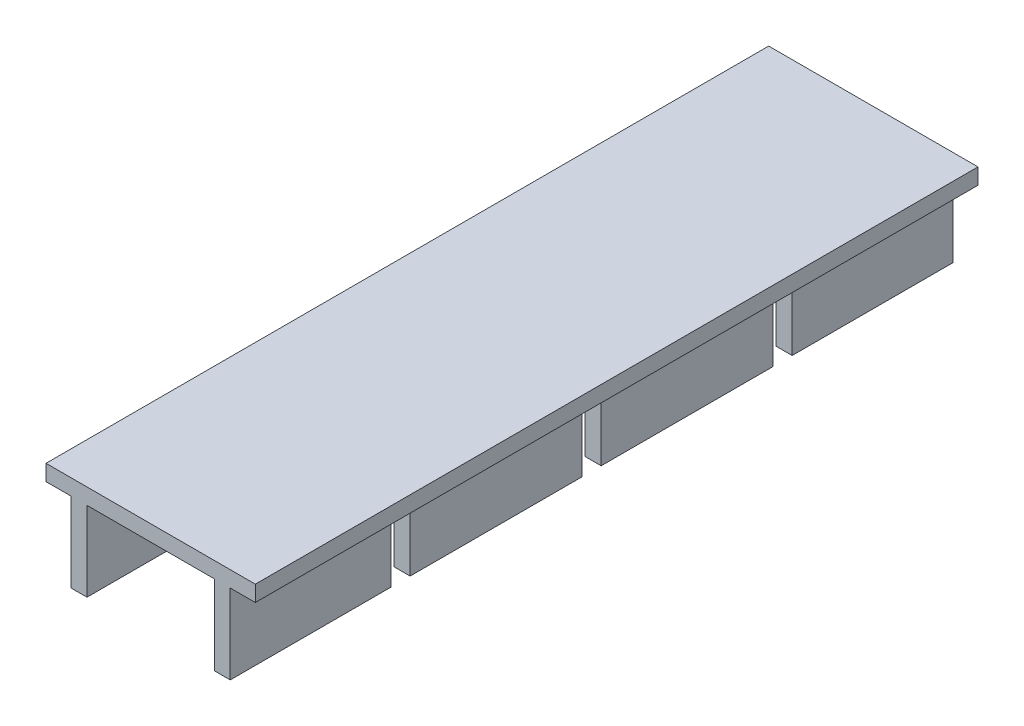
ISO-10303-21;
HEADER;
FILE_DESCRIPTION(('STEP AP214'),'2;1');
FILE_NAME('part.step','',(''),(''),'','','');
FILE_SCHEMA(('AUTOMOTIVE_DESIGN { 1 0 10303 214 1 1 1 1 }'));
ENDSEC;
DATA;
#1=APPLICATION_CONTEXT('core data for automotive mechanical design processes');
#2=APPLICATION_PROTOCOL_DEFINITION('international standard','automotive_design',2000,#1);
#3=PRODUCT_CONTEXT('',#1,'mechanical');
#4=PRODUCT('Part','Part','',(#3));
#5=PRODUCT_RELATED_PRODUCT_CATEGORY('part','',(#4));
#6=PRODUCT_DEFINITION_FORMATION('','',#4);
#7=PRODUCT_DEFINITION_CONTEXT('part definition',#1,'design');
#8=PRODUCT_DEFINITION('design','',#6,#7);
#9=PRODUCT_DEFINITION_SHAPE('','',#8);
#10=(LENGTH_UNIT() NAMED_UNIT(*) SI_UNIT(.MILLI.,.METRE.));
#11=(NAMED_UNIT(*) PLANE_ANGLE_UNIT() SI_UNIT($,.RADIAN.));
#12=(NAMED_UNIT(*) SI_UNIT($,.STERADIAN.) SOLID_ANGLE_UNIT());
#13=UNCERTAINTY_MEASURE_WITH_UNIT(LENGTH_MEASURE(1.E-05),#10,'distance_accuracy_value','');
#14=(GEOMETRIC_REPRESENTATION_CONTEXT(3) GLOBAL_UNCERTAINTY_ASSIGNED_CONTEXT((#13)) GLOBAL_UNIT_ASSIGNED_CONTEXT((#10,
#11,#12)) REPRESENTATION_CONTEXT('',''));
#15=CARTESIAN_POINT('',(0.,0.,0.));
#16=DIRECTION('',(0.,0.,1.));
#17=DIRECTION('',(1.,0.,0.));
#18=AXIS2_PLACEMENT_3D('',#15,#16,#17);
#19=CARTESIAN_POINT('',(0.,0.,288.29));
#20=DIRECTION('',(0.,1.,0.));
#21=DIRECTION('',(0.,0.,1.));
#22=AXIS2_PLACEMENT_3D('',#19,#20,#21);
#23=PLANE('',#22);
#24=DIRECTION('',(0.,0.,-1.));
#25=VECTOR('',#24,1.);
#26=CARTESIAN_POINT('',(0.,0.,288.29));
#27=LINE('',#26,#25);
#28=CARTESIAN_POINT('',(0.,0.,216.535));
#29=VERTEX_POINT('',#28);
#30=CARTESIAN_POINT('',(0.,0.,147.955));
#31=VERTEX_POINT('',#30);
#32=EDGE_CURVE('E51',#29,#31,#27,.T.);
#33=ORIENTED_EDGE('',*,*,#32,.T.);
#34=DIRECTION('',(1.,0.,0.));
#35=VECTOR('',#34,1.);
#36=CARTESIAN_POINT('',(-25.0019910457147,0.,147.955));
#37=LINE('',#36,#35);
#38=CARTESIAN_POINT('',(6.34999999999999,0.,147.955));
#39=VERTEX_POINT('',#38);
#40=EDGE_CURVE('E298',#31,#39,#37,.T.);
#41=ORIENTED_EDGE('',*,*,#40,.T.);
#42=DIRECTION('',(0.,0.,-1.));
#43=VECTOR('',#42,1.);
#44=CARTESIAN_POINT('',(6.35,0.,288.29));
#45=LINE('',#44,#43);
#46=CARTESIAN_POINT('',(6.35,0.,216.535));
#47=VERTEX_POINT('',#46);
#48=EDGE_CURVE('E328',#47,#39,#45,.T.);
#49=ORIENTED_EDGE('',*,*,#48,.F.);
#50=DIRECTION('',(1.,0.,0.));
#51=VECTOR('',#50,1.);
#52=CARTESIAN_POINT('',(-25.0019910457147,0.,216.535));
#53=LINE('',#52,#51);
#54=EDGE_CURVE('E413',#29,#47,#53,.T.);
#55=ORIENTED_EDGE('',*,*,#54,.F.);
#56=EDGE_LOOP('',(#33,#41,#49,#55));
#57=FACE_BOUND('',#56,.T.);
#58=ADVANCED_FACE('F43',(#57),#23,.F.);
#59=CARTESIAN_POINT('',(6.35,0.,140.335));
#60=VERTEX_POINT('',#59);
#61=CARTESIAN_POINT('',(6.34999999999999,0.,71.755));
#62=VERTEX_POINT('',#61);
#63=EDGE_CURVE('E335',#60,#62,#45,.T.);
#64=ORIENTED_EDGE('',*,*,#63,.F.);
#65=DIRECTION('',(1.,0.,0.));
#66=VECTOR('',#65,1.);
#67=CARTESIAN_POINT('',(-25.0019910457147,0.,140.335));
#68=LINE('',#67,#66);
#69=CARTESIAN_POINT('',(0.,0.,140.335));
#70=VERTEX_POINT('',#69);
#71=EDGE_CURVE('E67',#70,#60,#68,.T.);
#72=ORIENTED_EDGE('',*,*,#71,.F.);
#73=CARTESIAN_POINT('',(0.,0.,71.755));
#74=VERTEX_POINT('',#73);
#75=EDGE_CURVE('E333',#70,#74,#27,.T.);
#76=ORIENTED_EDGE('',*,*,#75,.T.);
#77=DIRECTION('',(1.,0.,0.));
#78=VECTOR('',#77,1.);
#79=CARTESIAN_POINT('',(-25.0019910457147,0.,71.755));
#80=LINE('',#79,#78);
#81=EDGE_CURVE('E351',#74,#62,#80,.T.);
#82=ORIENTED_EDGE('',*,*,#81,.T.);
#83=EDGE_LOOP('',(#64,#72,#76,#82));
#84=FACE_BOUND('',#83,.T.);
#85=ADVANCED_FACE('F348',(#84),#23,.F.);
#86=CARTESIAN_POINT('',(57.15,0.,288.29));
#87=DIRECTION('',(0.,1.,0.));
#88=DIRECTION('',(0.,0.,1.));
#89=AXIS2_PLACEMENT_3D('',#86,#87,#88);
#90=PLANE('',#89);
#91=DIRECTION('',(0.,0.,-1.));
#92=VECTOR('',#91,1.);
#93=CARTESIAN_POINT('',(57.15,0.,288.29));
#94=LINE('',#93,#92);
#95=CARTESIAN_POINT('',(57.15,0.,216.535));
#96=VERTEX_POINT('',#95);
#97=CARTESIAN_POINT('',(57.15,0.,147.955));
#98=VERTEX_POINT('',#97);
#99=EDGE_CURVE('E297',#96,#98,#94,.T.);
#100=ORIENTED_EDGE('',*,*,#99,.T.);
#101=CARTESIAN_POINT('',(63.5,0.,147.955));
#102=VERTEX_POINT('',#101);
#103=EDGE_CURVE('E279',#98,#102,#37,.T.);
#104=ORIENTED_EDGE('',*,*,#103,.T.);
#105=DIRECTION('',(0.,0.,-1.));
#106=VECTOR('',#105,1.);
#107=CARTESIAN_POINT('',(63.5,0.,288.29));
#108=LINE('',#107,#106);
#109=CARTESIAN_POINT('',(63.5,0.,216.535));
#110=VERTEX_POINT('',#109);
#111=EDGE_CURVE('E295',#110,#102,#108,.T.);
#112=ORIENTED_EDGE('',*,*,#111,.F.);
#113=EDGE_CURVE('E415',#96,#110,#53,.T.);
#114=ORIENTED_EDGE('',*,*,#113,.F.);
#115=EDGE_LOOP('',(#100,#104,#112,#114));
#116=FACE_BOUND('',#115,.T.);
#117=ADVANCED_FACE('F293',(#116),#90,.F.);
#118=CARTESIAN_POINT('',(63.5,0.,140.335));
#119=VERTEX_POINT('',#118);
#120=CARTESIAN_POINT('',(63.5,0.,71.755));
#121=VERTEX_POINT('',#120);
#122=EDGE_CURVE('E307',#119,#121,#108,.T.);
#123=ORIENTED_EDGE('',*,*,#122,.F.);
#124=CARTESIAN_POINT('',(57.15,0.,140.335));
#125=VERTEX_POINT('',#124);
#126=EDGE_CURVE('E564',#125,#119,#68,.T.);
#127=ORIENTED_EDGE('',*,*,#126,.F.);
#128=CARTESIAN_POINT('',(57.15,0.,71.755));
#129=VERTEX_POINT('',#128);
#130=EDGE_CURVE('E526',#125,#129,#94,.T.);
#131=ORIENTED_EDGE('',*,*,#130,.T.);
#132=EDGE_CURVE('E355',#129,#121,#80,.T.);
#133=ORIENTED_EDGE('',*,*,#132,.T.);
#134=EDGE_LOOP('',(#123,#127,#131,#133));
#135=FACE_BOUND('',#134,.T.);
#136=ADVANCED_FACE('F599',(#135),#90,.F.);
#137=CARTESIAN_POINT('',(0.,0.,288.29));
#138=VERTEX_POINT('',#137);
#139=CARTESIAN_POINT('',(0.,0.,224.155));
#140=VERTEX_POINT('',#139);
#141=EDGE_CURVE('E11',#138,#140,#27,.T.);
#142=ORIENTED_EDGE('',*,*,#141,.T.);
#143=DIRECTION('',(1.,0.,0.));
#144=VECTOR('',#143,1.);
#145=CARTESIAN_POINT('',(-25.0019910457147,0.,224.155));
#146=LINE('',#145,#144);
#147=CARTESIAN_POINT('',(6.34999999999999,0.,224.155));
#148=VERTEX_POINT('',#147);
#149=EDGE_CURVE('E416',#140,#148,#146,.T.);
#150=ORIENTED_EDGE('',*,*,#149,.T.);
#151=CARTESIAN_POINT('',(6.35,0.,288.29));
#152=VERTEX_POINT('',#151);
#153=EDGE_CURVE('E326',#152,#148,#45,.T.);
#154=ORIENTED_EDGE('',*,*,#153,.F.);
#155=DIRECTION('',(1.,0.,0.));
#156=VECTOR('',#155,1.);
#157=CARTESIAN_POINT('',(0.,0.,288.29));
#158=LINE('',#157,#156);
#159=EDGE_CURVE('E439',#138,#152,#158,.T.);
#160=ORIENTED_EDGE('',*,*,#159,.F.);
#161=EDGE_LOOP('',(#142,#150,#154,#160));
#162=FACE_BOUND('',#161,.T.);
#163=ADVANCED_FACE('F542',(#162),#23,.F.);
#164=CARTESIAN_POINT('',(57.15,0.,288.29));
#165=VERTEX_POINT('',#164);
#166=CARTESIAN_POINT('',(57.15,0.,224.155));
#167=VERTEX_POINT('',#166);
#168=EDGE_CURVE('E317',#165,#167,#94,.T.);
#169=ORIENTED_EDGE('',*,*,#168,.T.);
#170=CARTESIAN_POINT('',(63.5,0.,224.155));
#171=VERTEX_POINT('',#170);
#172=EDGE_CURVE('E405',#167,#171,#146,.T.);
#173=ORIENTED_EDGE('',*,*,#172,.T.);
#174=CARTESIAN_POINT('',(63.5,0.,288.29));
#175=VERTEX_POINT('',#174);
#176=EDGE_CURVE('E306',#175,#171,#108,.T.);
#177=ORIENTED_EDGE('',*,*,#176,.F.);
#178=DIRECTION('',(1.,0.,0.));
#179=VECTOR('',#178,1.);
#180=CARTESIAN_POINT('',(57.15,0.,288.29));
#181=LINE('',#180,#179);
#182=EDGE_CURVE('E448',#165,#175,#181,.T.);
#183=ORIENTED_EDGE('',*,*,#182,.F.);
#184=EDGE_LOOP('',(#169,#173,#177,#183));
#185=FACE_BOUND('',#184,.T.);
#186=ADVANCED_FACE('F669',(#185),#90,.F.);
#187=CARTESIAN_POINT('',(0.,0.,288.29));
#188=DIRECTION('',(1.,0.,0.));
#189=DIRECTION('',(0.,0.,-1.));
#190=AXIS2_PLACEMENT_3D('',#187,#188,#189);
#191=PLANE('',#190);
#192=DIRECTION('',(0.,0.,-1.));
#193=VECTOR('',#192,1.);
#194=CARTESIAN_POINT('',(0.,23.8125,147.955));
#195=LINE('',#194,#193);
#196=CARTESIAN_POINT('',(0.,23.8125,147.955));
#197=VERTEX_POINT('',#196);
#198=CARTESIAN_POINT('',(0.,23.8125,140.335));
#199=VERTEX_POINT('',#198);
#200=EDGE_CURVE('E618',#197,#199,#195,.T.);
#201=ORIENTED_EDGE('',*,*,#200,.F.);
#202=DIRECTION('',(0.,1.,0.));
#203=VECTOR('',#202,1.);
#204=CARTESIAN_POINT('',(0.,0.,147.955));
#205=LINE('',#204,#203);
#206=EDGE_CURVE('E366',#31,#197,#205,.T.);
#207=ORIENTED_EDGE('',*,*,#206,.F.);
#208=ORIENTED_EDGE('',*,*,#32,.F.);
#209=DIRECTION('',(0.,-1.,0.));
#210=VECTOR('',#209,1.);
#211=CARTESIAN_POINT('',(0.,0.,216.535));
#212=LINE('',#211,#210);
#213=CARTESIAN_POINT('',(0.,23.8125,216.535));
#214=VERTEX_POINT('',#213);
#215=EDGE_CURVE('E392',#214,#29,#212,.T.);
#216=ORIENTED_EDGE('',*,*,#215,.F.);
#217=DIRECTION('',(0.,0.,-1.));
#218=VECTOR('',#217,1.);
#219=CARTESIAN_POINT('',(0.,23.8125,224.155));
#220=LINE('',#219,#218);
#221=CARTESIAN_POINT('',(0.,23.8125,224.155));
#222=VERTEX_POINT('',#221);
#223=EDGE_CURVE('E394',#222,#214,#220,.T.);
#224=ORIENTED_EDGE('',*,*,#223,.F.);
#225=DIRECTION('',(0.,1.,0.));
#226=VECTOR('',#225,1.);
#227=CARTESIAN_POINT('',(0.,0.,224.155));
#228=LINE('',#227,#226);
#229=EDGE_CURVE('E397',#140,#222,#228,.T.);
#230=ORIENTED_EDGE('',*,*,#229,.F.);
#231=ORIENTED_EDGE('',*,*,#141,.F.);
#232=DIRECTION('',(0.,-1.,0.));
#233=VECTOR('',#232,1.);
#234=CARTESIAN_POINT('',(0.,0.,288.29));
#235=LINE('',#234,#233);
#236=CARTESIAN_POINT('',(0.,31.75,288.29));
#237=VERTEX_POINT('',#236);
#238=EDGE_CURVE('E436',#237,#138,#235,.T.);
#239=ORIENTED_EDGE('',*,*,#238,.F.);
#240=DIRECTION('',(0.,0.,-1.));
#241=VECTOR('',#240,1.);
#242=CARTESIAN_POINT('',(0.,31.75,288.29));
#243=LINE('',#242,#241);
#244=CARTESIAN_POINT('',(0.,31.75,0.));
#245=VERTEX_POINT('',#244);
#246=EDGE_CURVE('E462',#237,#245,#243,.T.);
#247=ORIENTED_EDGE('',*,*,#246,.T.);
#248=DIRECTION('',(0.,-1.,0.));
#249=VECTOR('',#248,1.);
#250=CARTESIAN_POINT('',(0.,0.,0.));
#251=LINE('',#250,#249);
#252=CARTESIAN_POINT('',(0.,0.,0.));
#253=VERTEX_POINT('',#252);
#254=EDGE_CURVE('E435',#245,#253,#251,.T.);
#255=ORIENTED_EDGE('',*,*,#254,.T.);
#256=CARTESIAN_POINT('',(0.,0.,64.135));
#257=VERTEX_POINT('',#256);
#258=EDGE_CURVE('E52',#257,#253,#27,.T.);
#259=ORIENTED_EDGE('',*,*,#258,.F.);
#260=DIRECTION('',(0.,-1.,0.));
#261=VECTOR('',#260,1.);
#262=CARTESIAN_POINT('',(0.,0.,64.135));
#263=LINE('',#262,#261);
#264=CARTESIAN_POINT('',(0.,23.8125,64.135));
#265=VERTEX_POINT('',#264);
#266=EDGE_CURVE('E568',#265,#257,#263,.T.);
#267=ORIENTED_EDGE('',*,*,#266,.F.);
#268=DIRECTION('',(0.,0.,-1.));
#269=VECTOR('',#268,1.);
#270=CARTESIAN_POINT('',(0.,23.8125,71.755));
#271=LINE('',#270,#269);
#272=CARTESIAN_POINT('',(0.,23.8125,71.755));
#273=VERTEX_POINT('',#272);
#274=EDGE_CURVE('E570',#273,#265,#271,.T.);
#275=ORIENTED_EDGE('',*,*,#274,.F.);
#276=DIRECTION('',(0.,1.,0.));
#277=VECTOR('',#276,1.);
#278=CARTESIAN_POINT('',(0.,0.,71.755));
#279=LINE('',#278,#277);
#280=EDGE_CURVE('E288',#74,#273,#279,.T.);
#281=ORIENTED_EDGE('',*,*,#280,.F.);
#282=ORIENTED_EDGE('',*,*,#75,.F.);
#283=DIRECTION('',(0.,-1.,0.));
#284=VECTOR('',#283,1.);
#285=CARTESIAN_POINT('',(0.,0.,140.335));
#286=LINE('',#285,#284);
#287=EDGE_CURVE('E614',#199,#70,#286,.T.);
#288=ORIENTED_EDGE('',*,*,#287,.F.);
#289=EDGE_LOOP('',(#201,#207,#208,#216,#224,#230,#231,#239,#247,#255,#259,#267,#275,#281,#282,#288));
#290=FACE_BOUND('',#289,.T.);
#291=ADVANCED_FACE('F45',(#290),#191,.F.);
#292=CARTESIAN_POINT('',(6.35,0.,64.135));
#293=VERTEX_POINT('',#292);
#294=CARTESIAN_POINT('',(6.35,0.,0.));
#295=VERTEX_POINT('',#294);
#296=EDGE_CURVE('E325',#293,#295,#45,.T.);
#297=ORIENTED_EDGE('',*,*,#296,.F.);
#298=DIRECTION('',(1.,0.,0.));
#299=VECTOR('',#298,1.);
#300=CARTESIAN_POINT('',(-25.0019910457147,0.,64.135));
#301=LINE('',#300,#299);
#302=EDGE_CURVE('E59',#257,#293,#301,.T.);
#303=ORIENTED_EDGE('',*,*,#302,.F.);
#304=ORIENTED_EDGE('',*,*,#258,.T.);
#305=DIRECTION('',(1.,0.,0.));
#306=VECTOR('',#305,1.);
#307=CARTESIAN_POINT('',(0.,0.,0.));
#308=LINE('',#307,#306);
#309=EDGE_CURVE('E465',#253,#295,#308,.T.);
#310=ORIENTED_EDGE('',*,*,#309,.T.);
#311=EDGE_LOOP('',(#297,#303,#304,#310));
#312=FACE_BOUND('',#311,.T.);
#313=ADVANCED_FACE('F629',(#312),#23,.F.);
#314=CARTESIAN_POINT('',(6.35,0.,288.29));
#315=DIRECTION('',(-1.,0.,0.));
#316=DIRECTION('',(0.,0.,1.));
#317=AXIS2_PLACEMENT_3D('',#314,#315,#316);
#318=PLANE('',#317);
#319=ORIENTED_EDGE('',*,*,#48,.T.);
#320=DIRECTION('',(0.,1.,0.));
#321=VECTOR('',#320,1.);
#322=CARTESIAN_POINT('',(6.35,0.,147.955));
#323=LINE('',#322,#321);
#324=CARTESIAN_POINT('',(6.34999999999999,23.8125,147.955));
#325=VERTEX_POINT('',#324);
#326=EDGE_CURVE('E388',#39,#325,#323,.T.);
#327=ORIENTED_EDGE('',*,*,#326,.T.);
#328=DIRECTION('',(0.,0.,-1.));
#329=VECTOR('',#328,1.);
#330=CARTESIAN_POINT('',(6.35,23.8125,288.29));
#331=LINE('',#330,#329);
#332=CARTESIAN_POINT('',(6.34999999999999,23.8125,140.335));
#333=VERTEX_POINT('',#332);
#334=EDGE_CURVE('E384',#325,#333,#331,.T.);
#335=ORIENTED_EDGE('',*,*,#334,.T.);
#336=DIRECTION('',(0.,-1.,0.));
#337=VECTOR('',#336,1.);
#338=CARTESIAN_POINT('',(6.35,0.,140.335));
#339=LINE('',#338,#337);
#340=EDGE_CURVE('E345',#333,#60,#339,.T.);
#341=ORIENTED_EDGE('',*,*,#340,.T.);
#342=ORIENTED_EDGE('',*,*,#63,.T.);
#343=DIRECTION('',(0.,1.,0.));
#344=VECTOR('',#343,1.);
#345=CARTESIAN_POINT('',(6.35,0.,71.755));
#346=LINE('',#345,#344);
#347=CARTESIAN_POINT('',(6.34999999999999,23.8125,71.755));
#348=VERTEX_POINT('',#347);
#349=EDGE_CURVE('E343',#62,#348,#346,.T.);
#350=ORIENTED_EDGE('',*,*,#349,.T.);
#351=DIRECTION('',(0.,0.,-1.));
#352=VECTOR('',#351,1.);
#353=CARTESIAN_POINT('',(6.35,23.8125,288.29));
#354=LINE('',#353,#352);
#355=CARTESIAN_POINT('',(6.34999999999999,23.8125,64.135));
#356=VERTEX_POINT('',#355);
#357=EDGE_CURVE('E371',#348,#356,#354,.T.);
#358=ORIENTED_EDGE('',*,*,#357,.T.);
#359=DIRECTION('',(0.,-1.,0.));
#360=VECTOR('',#359,1.);
#361=CARTESIAN_POINT('',(6.35,0.,64.135));
#362=LINE('',#361,#360);
#363=EDGE_CURVE('E365',#356,#293,#362,.T.);
#364=ORIENTED_EDGE('',*,*,#363,.T.);
#365=ORIENTED_EDGE('',*,*,#296,.T.);
#366=DIRECTION('',(0.,1.,0.));
#367=VECTOR('',#366,1.);
#368=CARTESIAN_POINT('',(6.35,0.,0.));
#369=LINE('',#368,#367);
#370=CARTESIAN_POINT('',(6.35,31.75,0.));
#371=VERTEX_POINT('',#370);
#372=EDGE_CURVE('E467',#295,#371,#369,.T.);
#373=ORIENTED_EDGE('',*,*,#372,.T.);
#374=DIRECTION('',(0.,0.,-1.));
#375=VECTOR('',#374,1.);
#376=CARTESIAN_POINT('',(6.35,31.75,288.29));
#377=LINE('',#376,#375);
#378=CARTESIAN_POINT('',(6.35,31.75,288.29));
#379=VERTEX_POINT('',#378);
#380=EDGE_CURVE('E323',#379,#371,#377,.T.);
#381=ORIENTED_EDGE('',*,*,#380,.F.);
#382=DIRECTION('',(0.,1.,0.));
#383=VECTOR('',#382,1.);
#384=CARTESIAN_POINT('',(6.35,0.,288.29));
#385=LINE('',#384,#383);
#386=EDGE_CURVE('E442',#152,#379,#385,.T.);
#387=ORIENTED_EDGE('',*,*,#386,.F.);
#388=ORIENTED_EDGE('',*,*,#153,.T.);
#389=DIRECTION('',(0.,1.,0.));
#390=VECTOR('',#389,1.);
#391=CARTESIAN_POINT('',(6.35,0.,224.155));
#392=LINE('',#391,#390);
#393=CARTESIAN_POINT('',(6.34999999999999,23.8125,224.155));
#394=VERTEX_POINT('',#393);
#395=EDGE_CURVE('E433',#148,#394,#392,.T.);
#396=ORIENTED_EDGE('',*,*,#395,.T.);
#397=DIRECTION('',(0.,0.,-1.));
#398=VECTOR('',#397,1.);
#399=CARTESIAN_POINT('',(6.35,23.8125,288.29));
#400=LINE('',#399,#398);
#401=CARTESIAN_POINT('',(6.34999999999999,23.8125,216.535));
#402=VERTEX_POINT('',#401);
#403=EDGE_CURVE('E427',#394,#402,#400,.T.);
#404=ORIENTED_EDGE('',*,*,#403,.T.);
#405=DIRECTION('',(0.,-1.,0.));
#406=VECTOR('',#405,1.);
#407=CARTESIAN_POINT('',(6.35,0.,216.535));
#408=LINE('',#407,#406);
#409=EDGE_CURVE('E421',#402,#47,#408,.T.);
#410=ORIENTED_EDGE('',*,*,#409,.T.);
#411=EDGE_LOOP('',(#319,#327,#335,#341,#342,#350,#358,#364,#365,#373,#381,#387,#388,#396,#404,#410));
#412=FACE_BOUND('',#411,.T.);
#413=ADVANCED_FACE('F341',(#412),#318,.F.);
#414=CARTESIAN_POINT('',(6.35,31.75,288.29));
#415=DIRECTION('',(0.,1.,0.));
#416=DIRECTION('',(0.,0.,1.));
#417=AXIS2_PLACEMENT_3D('',#414,#415,#416);
#418=PLANE('',#417);
#419=DIRECTION('',(1.,0.,0.));
#420=VECTOR('',#419,1.);
#421=CARTESIAN_POINT('',(6.35,31.75,0.));
#422=LINE('',#421,#420);
#423=CARTESIAN_POINT('',(57.15,31.75,0.));
#424=VERTEX_POINT('',#423);
#425=EDGE_CURVE('E469',#371,#424,#422,.T.);
#426=ORIENTED_EDGE('',*,*,#425,.T.);
#427=DIRECTION('',(0.,0.,-1.));
#428=VECTOR('',#427,1.);
#429=CARTESIAN_POINT('',(57.15,31.75,288.29));
#430=LINE('',#429,#428);
#431=CARTESIAN_POINT('',(57.15,31.75,288.29));
#432=VERTEX_POINT('',#431);
#433=EDGE_CURVE('E320',#432,#424,#430,.T.);
#434=ORIENTED_EDGE('',*,*,#433,.F.);
#435=DIRECTION('',(1.,0.,0.));
#436=VECTOR('',#435,1.);
#437=CARTESIAN_POINT('',(6.35,31.75,288.29));
#438=LINE('',#437,#436);
#439=EDGE_CURVE('E444',#379,#432,#438,.T.);
#440=ORIENTED_EDGE('',*,*,#439,.F.);
#441=ORIENTED_EDGE('',*,*,#380,.T.);
#442=EDGE_LOOP('',(#426,#434,#440,#441));
#443=FACE_BOUND('',#442,.T.);
#444=ADVANCED_FACE('F534',(#443),#418,.F.);
#445=CARTESIAN_POINT('',(57.15,0.,288.29));
#446=DIRECTION('',(1.,0.,0.));
#447=DIRECTION('',(0.,0.,-1.));
#448=AXIS2_PLACEMENT_3D('',#445,#446,#447);
#449=PLANE('',#448);
#450=DIRECTION('',(0.,0.,1.));
#451=VECTOR('',#450,1.);
#452=CARTESIAN_POINT('',(57.15,23.8125,288.29));
#453=LINE('',#452,#451);
#454=CARTESIAN_POINT('',(57.15,23.8125,140.335));
#455=VERTEX_POINT('',#454);
#456=CARTESIAN_POINT('',(57.15,23.8125,147.955));
#457=VERTEX_POINT('',#456);
#458=EDGE_CURVE('E381',#455,#457,#453,.T.);
#459=ORIENTED_EDGE('',*,*,#458,.T.);
#460=DIRECTION('',(0.,-1.,0.));
#461=VECTOR('',#460,1.);
#462=CARTESIAN_POINT('',(57.15,0.,147.955));
#463=LINE('',#462,#461);
#464=EDGE_CURVE('E386',#457,#98,#463,.T.);
#465=ORIENTED_EDGE('',*,*,#464,.T.);
#466=ORIENTED_EDGE('',*,*,#99,.F.);
#467=DIRECTION('',(0.,1.,0.));
#468=VECTOR('',#467,1.);
#469=CARTESIAN_POINT('',(57.15,0.,216.535));
#470=LINE('',#469,#468);
#471=CARTESIAN_POINT('',(57.15,23.8125,216.535));
#472=VERTEX_POINT('',#471);
#473=EDGE_CURVE('E399',#96,#472,#470,.T.);
#474=ORIENTED_EDGE('',*,*,#473,.T.);
#475=DIRECTION('',(0.,0.,1.));
#476=VECTOR('',#475,1.);
#477=CARTESIAN_POINT('',(57.15,23.8125,288.29));
#478=LINE('',#477,#476);
#479=CARTESIAN_POINT('',(57.15,23.8125,224.155));
#480=VERTEX_POINT('',#479);
#481=EDGE_CURVE('E424',#472,#480,#478,.T.);
#482=ORIENTED_EDGE('',*,*,#481,.T.);
#483=DIRECTION('',(0.,-1.,0.));
#484=VECTOR('',#483,1.);
#485=CARTESIAN_POINT('',(57.15,0.,224.155));
#486=LINE('',#485,#484);
#487=EDGE_CURVE('E430',#480,#167,#486,.T.);
#488=ORIENTED_EDGE('',*,*,#487,.T.);
#489=ORIENTED_EDGE('',*,*,#168,.F.);
#490=DIRECTION('',(0.,-1.,0.));
#491=VECTOR('',#490,1.);
#492=CARTESIAN_POINT('',(57.15,0.,288.29));
#493=LINE('',#492,#491);
#494=EDGE_CURVE('E446',#432,#165,#493,.T.);
#495=ORIENTED_EDGE('',*,*,#494,.F.);
#496=ORIENTED_EDGE('',*,*,#433,.T.);
#497=DIRECTION('',(0.,-1.,0.));
#498=VECTOR('',#497,1.);
#499=CARTESIAN_POINT('',(57.15,0.,0.));
#500=LINE('',#499,#498);
#501=CARTESIAN_POINT('',(57.15,0.,0.));
#502=VERTEX_POINT('',#501);
#503=EDGE_CURVE('E471',#424,#502,#500,.T.);
#504=ORIENTED_EDGE('',*,*,#503,.T.);
#505=CARTESIAN_POINT('',(57.15,0.,64.135));
#506=VERTEX_POINT('',#505);
#507=EDGE_CURVE('E310',#506,#502,#94,.T.);
#508=ORIENTED_EDGE('',*,*,#507,.F.);
#509=DIRECTION('',(0.,1.,0.));
#510=VECTOR('',#509,1.);
#511=CARTESIAN_POINT('',(57.15,0.,64.135));
#512=LINE('',#511,#510);
#513=CARTESIAN_POINT('',(57.15,23.8125,64.135));
#514=VERTEX_POINT('',#513);
#515=EDGE_CURVE('E362',#506,#514,#512,.T.);
#516=ORIENTED_EDGE('',*,*,#515,.T.);
#517=DIRECTION('',(0.,0.,1.));
#518=VECTOR('',#517,1.);
#519=CARTESIAN_POINT('',(57.15,23.8125,288.29));
#520=LINE('',#519,#518);
#521=CARTESIAN_POINT('',(57.15,23.8125,71.755));
#522=VERTEX_POINT('',#521);
#523=EDGE_CURVE('E368',#514,#522,#520,.T.);
#524=ORIENTED_EDGE('',*,*,#523,.T.);
#525=DIRECTION('',(0.,-1.,0.));
#526=VECTOR('',#525,1.);
#527=CARTESIAN_POINT('',(57.15,0.,71.755));
#528=LINE('',#527,#526);
#529=EDGE_CURVE('E373',#522,#129,#528,.T.);
#530=ORIENTED_EDGE('',*,*,#529,.T.);
#531=ORIENTED_EDGE('',*,*,#130,.F.);
#532=DIRECTION('',(0.,1.,0.));
#533=VECTOR('',#532,1.);
#534=CARTESIAN_POINT('',(57.15,0.,140.335));
#535=LINE('',#534,#533);
#536=EDGE_CURVE('E377',#125,#455,#535,.T.);
#537=ORIENTED_EDGE('',*,*,#536,.T.);
#538=EDGE_LOOP('',(#459,#465,#466,#474,#482,#488,#489,#495,#496,#504,#508,#516,#524,#530,#531,#537));
#539=FACE_BOUND('',#538,.T.);
#540=ADVANCED_FACE('F527',(#539),#449,.F.);
#541=CARTESIAN_POINT('',(63.5,0.,64.135));
#542=VERTEX_POINT('',#541);
#543=CARTESIAN_POINT('',(63.5,0.,0.));
#544=VERTEX_POINT('',#543);
#545=EDGE_CURVE('E311',#542,#544,#108,.T.);
#546=ORIENTED_EDGE('',*,*,#545,.F.);
#547=EDGE_CURVE('E354',#506,#542,#301,.T.);
#548=ORIENTED_EDGE('',*,*,#547,.F.);
#549=ORIENTED_EDGE('',*,*,#507,.T.);
#550=DIRECTION('',(1.,0.,0.));
#551=VECTOR('',#550,1.);
#552=CARTESIAN_POINT('',(57.15,0.,0.));
#553=LINE('',#552,#551);
#554=EDGE_CURVE('E474',#502,#544,#553,.T.);
#555=ORIENTED_EDGE('',*,*,#554,.T.);
#556=EDGE_LOOP('',(#546,#548,#549,#555));
#557=FACE_BOUND('',#556,.T.);
#558=ADVANCED_FACE('F523',(#557),#90,.F.);
#559=CARTESIAN_POINT('',(63.5,9.52500000000001,288.29));
#560=DIRECTION('',(-1.,0.,0.));
#561=DIRECTION('',(0.,0.,1.));
#562=AXIS2_PLACEMENT_3D('',#559,#560,#561);
#563=PLANE('',#562);
#564=ORIENTED_EDGE('',*,*,#111,.T.);
#565=DIRECTION('',(0.,-1.,0.));
#566=VECTOR('',#565,1.);
#567=CARTESIAN_POINT('',(63.5,0.,147.955));
#568=LINE('',#567,#566);
#569=CARTESIAN_POINT('',(63.5,23.8125,147.955));
#570=VERTEX_POINT('',#569);
#571=EDGE_CURVE('E276',#570,#102,#568,.T.);
#572=ORIENTED_EDGE('',*,*,#571,.F.);
#573=DIRECTION('',(0.,0.,1.));
#574=VECTOR('',#573,1.);
#575=CARTESIAN_POINT('',(63.5,23.8125,147.955));
#576=LINE('',#575,#574);
#577=CARTESIAN_POINT('',(63.5,23.8125,140.335));
#578=VERTEX_POINT('',#577);
#579=EDGE_CURVE('E299',#578,#570,#576,.T.);
#580=ORIENTED_EDGE('',*,*,#579,.F.);
#581=DIRECTION('',(0.,1.,0.));
#582=VECTOR('',#581,1.);
#583=CARTESIAN_POINT('',(63.5,0.,140.335));
#584=LINE('',#583,#582);
#585=EDGE_CURVE('E287',#119,#578,#584,.T.);
#586=ORIENTED_EDGE('',*,*,#585,.F.);
#587=ORIENTED_EDGE('',*,*,#122,.T.);
#588=DIRECTION('',(0.,-1.,0.));
#589=VECTOR('',#588,1.);
#590=CARTESIAN_POINT('',(63.5,0.,71.755));
#591=LINE('',#590,#589);
#592=CARTESIAN_POINT('',(63.5,23.8125,71.755));
#593=VERTEX_POINT('',#592);
#594=EDGE_CURVE('E574',#593,#121,#591,.T.);
#595=ORIENTED_EDGE('',*,*,#594,.F.);
#596=DIRECTION('',(0.,0.,1.));
#597=VECTOR('',#596,1.);
#598=CARTESIAN_POINT('',(63.5,23.8125,71.755));
#599=LINE('',#598,#597);
#600=CARTESIAN_POINT('',(63.5,23.8125,64.135));
#601=VERTEX_POINT('',#600);
#602=EDGE_CURVE('E359',#601,#593,#599,.T.);
#603=ORIENTED_EDGE('',*,*,#602,.F.);
#604=DIRECTION('',(0.,1.,0.));
#605=VECTOR('',#604,1.);
#606=CARTESIAN_POINT('',(63.5,0.,64.135));
#607=LINE('',#606,#605);
#608=EDGE_CURVE('E515',#542,#601,#607,.T.);
#609=ORIENTED_EDGE('',*,*,#608,.F.);
#610=ORIENTED_EDGE('',*,*,#545,.T.);
#611=DIRECTION('',(0.,1.,0.));
#612=VECTOR('',#611,1.);
#613=CARTESIAN_POINT('',(63.5,9.52500000000001,0.));
#614=LINE('',#613,#612);
#615=CARTESIAN_POINT('',(63.5,31.75,0.));
#616=VERTEX_POINT('',#615);
#617=EDGE_CURVE('E477',#544,#616,#614,.T.);
#618=ORIENTED_EDGE('',*,*,#617,.T.);
#619=DIRECTION('',(0.,0.,-1.));
#620=VECTOR('',#619,1.);
#621=CARTESIAN_POINT('',(63.5,31.75,288.29));
#622=LINE('',#621,#620);
#623=CARTESIAN_POINT('',(63.5,31.75,288.29));
#624=VERTEX_POINT('',#623);
#625=EDGE_CURVE('E315',#624,#616,#622,.T.);
#626=ORIENTED_EDGE('',*,*,#625,.F.);
#627=DIRECTION('',(0.,1.,0.));
#628=VECTOR('',#627,1.);
#629=CARTESIAN_POINT('',(63.5,0.,288.29));
#630=LINE('',#629,#628);
#631=EDGE_CURVE('E450',#175,#624,#630,.T.);
#632=ORIENTED_EDGE('',*,*,#631,.F.);
#633=ORIENTED_EDGE('',*,*,#176,.T.);
#634=DIRECTION('',(0.,-1.,0.));
#635=VECTOR('',#634,1.);
#636=CARTESIAN_POINT('',(63.5,0.,224.155));
#637=LINE('',#636,#635);
#638=CARTESIAN_POINT('',(63.5,23.8125,224.155));
#639=VERTEX_POINT('',#638);
#640=EDGE_CURVE('E391',#639,#171,#637,.T.);
#641=ORIENTED_EDGE('',*,*,#640,.F.);
#642=DIRECTION('',(0.,0.,1.));
#643=VECTOR('',#642,1.);
#644=CARTESIAN_POINT('',(63.5,23.8125,224.155));
#645=LINE('',#644,#643);
#646=CARTESIAN_POINT('',(63.5,23.8125,216.535));
#647=VERTEX_POINT('',#646);
#648=EDGE_CURVE('E402',#647,#639,#645,.T.);
#649=ORIENTED_EDGE('',*,*,#648,.F.);
#650=DIRECTION('',(0.,1.,0.));
#651=VECTOR('',#650,1.);
#652=CARTESIAN_POINT('',(63.5,0.,216.535));
#653=LINE('',#652,#651);
#654=EDGE_CURVE('E305',#110,#647,#653,.T.);
#655=ORIENTED_EDGE('',*,*,#654,.F.);
#656=EDGE_LOOP('',(#564,#572,#580,#586,#587,#595,#603,#609,#610,#618,#626,#632,#633,#641,#649,#655));
#657=FACE_BOUND('',#656,.T.);
#658=ADVANCED_FACE('F302',(#657),#563,.F.);
#659=CARTESIAN_POINT('',(63.5,31.75,288.29));
#660=DIRECTION('',(0.,1.,0.));
#661=DIRECTION('',(0.,0.,1.));
#662=AXIS2_PLACEMENT_3D('',#659,#660,#661);
#663=PLANE('',#662);
#664=DIRECTION('',(1.,0.,0.));
#665=VECTOR('',#664,1.);
#666=CARTESIAN_POINT('',(63.5,31.75,0.));
#667=LINE('',#666,#665);
#668=CARTESIAN_POINT('',(73.5,31.75,0.));
#669=VERTEX_POINT('',#668);
#670=EDGE_CURVE('E479',#616,#669,#667,.T.);
#671=ORIENTED_EDGE('',*,*,#670,.T.);
#672=DIRECTION('',(0.,0.,-1.));
#673=VECTOR('',#672,1.);
#674=CARTESIAN_POINT('',(73.5,31.75,288.29));
#675=LINE('',#674,#673);
#676=CARTESIAN_POINT('',(73.5,31.75,288.29));
#677=VERTEX_POINT('',#676);
#678=EDGE_CURVE('E499',#677,#669,#675,.T.);
#679=ORIENTED_EDGE('',*,*,#678,.F.);
#680=DIRECTION('',(1.,0.,0.));
#681=VECTOR('',#680,1.);
#682=CARTESIAN_POINT('',(63.5,31.75,288.29));
#683=LINE('',#682,#681);
#684=EDGE_CURVE('E452',#624,#677,#683,.T.);
#685=ORIENTED_EDGE('',*,*,#684,.F.);
#686=ORIENTED_EDGE('',*,*,#625,.T.);
#687=EDGE_LOOP('',(#671,#679,#685,#686));
#688=FACE_BOUND('',#687,.T.);
#689=ADVANCED_FACE('F648',(#688),#663,.F.);
#690=CARTESIAN_POINT('',(73.5,38.1,288.29));
#691=DIRECTION('',(-1.,0.,0.));
#692=DIRECTION('',(0.,0.,1.));
#693=AXIS2_PLACEMENT_3D('',#690,#691,#692);
#694=PLANE('',#693);
#695=DIRECTION('',(0.,1.,0.));
#696=VECTOR('',#695,1.);
#697=CARTESIAN_POINT('',(73.5,38.1,0.));
#698=LINE('',#697,#696);
#699=CARTESIAN_POINT('',(73.5,38.1,0.));
#700=VERTEX_POINT('',#699);
#701=EDGE_CURVE('E481',#669,#700,#698,.T.);
#702=ORIENTED_EDGE('',*,*,#701,.T.);
#703=DIRECTION('',(0.,0.,-1.));
#704=VECTOR('',#703,1.);
#705=CARTESIAN_POINT('',(73.5,38.1,288.29));
#706=LINE('',#705,#704);
#707=CARTESIAN_POINT('',(73.5,38.1,288.29));
#708=VERTEX_POINT('',#707);
#709=EDGE_CURVE('E497',#708,#700,#706,.T.);
#710=ORIENTED_EDGE('',*,*,#709,.F.);
#711=DIRECTION('',(0.,1.,0.));
#712=VECTOR('',#711,1.);
#713=CARTESIAN_POINT('',(73.5,38.1,288.29));
#714=LINE('',#713,#712);
#715=EDGE_CURVE('E454',#677,#708,#714,.T.);
#716=ORIENTED_EDGE('',*,*,#715,.F.);
#717=ORIENTED_EDGE('',*,*,#678,.T.);
#718=EDGE_LOOP('',(#702,#710,#716,#717));
#719=FACE_BOUND('',#718,.T.);
#720=ADVANCED_FACE('F646',(#719),#694,.F.);
#721=CARTESIAN_POINT('',(0.,38.1,288.29));
#722=DIRECTION('',(0.,-1.,0.));
#723=DIRECTION('',(0.,0.,-1.));
#724=AXIS2_PLACEMENT_3D('',#721,#722,#723);
#725=PLANE('',#724);
#726=DIRECTION('',(-1.,0.,0.));
#727=VECTOR('',#726,1.);
#728=CARTESIAN_POINT('',(0.,38.1,0.));
#729=LINE('',#728,#727);
#730=CARTESIAN_POINT('',(-10.,38.1,0.));
#731=VERTEX_POINT('',#730);
#732=EDGE_CURVE('E484',#700,#731,#729,.T.);
#733=ORIENTED_EDGE('',*,*,#732,.T.);
#734=DIRECTION('',(0.,0.,-1.));
#735=VECTOR('',#734,1.);
#736=CARTESIAN_POINT('',(-10.,38.1,288.29));
#737=LINE('',#736,#735);
#738=CARTESIAN_POINT('',(-10.,38.1,288.29));
#739=VERTEX_POINT('',#738);
#740=EDGE_CURVE('E494',#739,#731,#737,.T.);
#741=ORIENTED_EDGE('',*,*,#740,.F.);
#742=DIRECTION('',(-1.,0.,0.));
#743=VECTOR('',#742,1.);
#744=CARTESIAN_POINT('',(63.5,38.1,288.29));
#745=LINE('',#744,#743);
#746=EDGE_CURVE('E456',#708,#739,#745,.T.);
#747=ORIENTED_EDGE('',*,*,#746,.F.);
#748=ORIENTED_EDGE('',*,*,#709,.T.);
#749=EDGE_LOOP('',(#733,#741,#747,#748));
#750=FACE_BOUND('',#749,.T.);
#751=ADVANCED_FACE('F644',(#750),#725,.F.);
#752=CARTESIAN_POINT('',(-10.,38.1,288.29));
#753=DIRECTION('',(1.,0.,0.));
#754=DIRECTION('',(0.,0.,-1.));
#755=AXIS2_PLACEMENT_3D('',#752,#753,#754);
#756=PLANE('',#755);
#757=DIRECTION('',(0.,-1.,0.));
#758=VECTOR('',#757,1.);
#759=CARTESIAN_POINT('',(-10.,38.1,0.));
#760=LINE('',#759,#758);
#761=CARTESIAN_POINT('',(-10.,31.75,0.));
#762=VERTEX_POINT('',#761);
#763=EDGE_CURVE('E486',#731,#762,#760,.T.);
#764=ORIENTED_EDGE('',*,*,#763,.T.);
#765=DIRECTION('',(0.,0.,-1.));
#766=VECTOR('',#765,1.);
#767=CARTESIAN_POINT('',(-10.,31.75,288.29));
#768=LINE('',#767,#766);
#769=CARTESIAN_POINT('',(-10.,31.75,288.29));
#770=VERTEX_POINT('',#769);
#771=EDGE_CURVE('E491',#770,#762,#768,.T.);
#772=ORIENTED_EDGE('',*,*,#771,.F.);
#773=DIRECTION('',(0.,-1.,0.));
#774=VECTOR('',#773,1.);
#775=CARTESIAN_POINT('',(-10.,38.1,288.29));
#776=LINE('',#775,#774);
#777=EDGE_CURVE('E458',#739,#770,#776,.T.);
#778=ORIENTED_EDGE('',*,*,#777,.F.);
#779=ORIENTED_EDGE('',*,*,#740,.T.);
#780=EDGE_LOOP('',(#764,#772,#778,#779));
#781=FACE_BOUND('',#780,.T.);
#782=ADVANCED_FACE('F639',(#781),#756,.F.);
#783=CARTESIAN_POINT('',(0.,31.75,288.29));
#784=DIRECTION('',(0.,1.,0.));
#785=DIRECTION('',(0.,0.,1.));
#786=AXIS2_PLACEMENT_3D('',#783,#784,#785);
#787=PLANE('',#786);
#788=DIRECTION('',(1.,0.,0.));
#789=VECTOR('',#788,1.);
#790=CARTESIAN_POINT('',(0.,31.75,0.));
#791=LINE('',#790,#789);
#792=EDGE_CURVE('E440',#762,#245,#791,.T.);
#793=ORIENTED_EDGE('',*,*,#792,.T.);
#794=ORIENTED_EDGE('',*,*,#246,.F.);
#795=DIRECTION('',(1.,0.,0.));
#796=VECTOR('',#795,1.);
#797=CARTESIAN_POINT('',(0.,31.75,288.29));
#798=LINE('',#797,#796);
#799=EDGE_CURVE('E460',#770,#237,#798,.T.);
#800=ORIENTED_EDGE('',*,*,#799,.F.);
#801=ORIENTED_EDGE('',*,*,#771,.T.);
#802=EDGE_LOOP('',(#793,#794,#800,#801));
#803=FACE_BOUND('',#802,.T.);
#804=ADVANCED_FACE('F635',(#803),#787,.F.);
#805=CARTESIAN_POINT('',(0.,0.,288.29));
#806=DIRECTION('',(0.,0.,1.));
#807=DIRECTION('',(1.,0.,0.));
#808=AXIS2_PLACEMENT_3D('',#805,#806,#807);
#809=PLANE('',#808);
#810=ORIENTED_EDGE('',*,*,#238,.T.);
#811=ORIENTED_EDGE('',*,*,#159,.T.);
#812=ORIENTED_EDGE('',*,*,#386,.T.);
#813=ORIENTED_EDGE('',*,*,#439,.T.);
#814=ORIENTED_EDGE('',*,*,#494,.T.);
#815=ORIENTED_EDGE('',*,*,#182,.T.);
#816=ORIENTED_EDGE('',*,*,#631,.T.);
#817=ORIENTED_EDGE('',*,*,#684,.T.);
#818=ORIENTED_EDGE('',*,*,#715,.T.);
#819=ORIENTED_EDGE('',*,*,#746,.T.);
#820=ORIENTED_EDGE('',*,*,#777,.T.);
#821=ORIENTED_EDGE('',*,*,#799,.T.);
#822=EDGE_LOOP('',(#810,#811,#812,#813,#814,#815,#816,#817,#818,#819,#820,#821));
#823=FACE_BOUND('',#822,.T.);
#824=ADVANCED_FACE('F538',(#823),#809,.T.);
#825=CARTESIAN_POINT('',(0.,0.,0.));
#826=DIRECTION('',(0.,0.,1.));
#827=DIRECTION('',(1.,0.,0.));
#828=AXIS2_PLACEMENT_3D('',#825,#826,#827);
#829=PLANE('',#828);
#830=ORIENTED_EDGE('',*,*,#254,.F.);
#831=ORIENTED_EDGE('',*,*,#792,.F.);
#832=ORIENTED_EDGE('',*,*,#763,.F.);
#833=ORIENTED_EDGE('',*,*,#732,.F.);
#834=ORIENTED_EDGE('',*,*,#701,.F.);
#835=ORIENTED_EDGE('',*,*,#670,.F.);
#836=ORIENTED_EDGE('',*,*,#617,.F.);
#837=ORIENTED_EDGE('',*,*,#554,.F.);
#838=ORIENTED_EDGE('',*,*,#503,.F.);
#839=ORIENTED_EDGE('',*,*,#425,.F.);
#840=ORIENTED_EDGE('',*,*,#372,.F.);
#841=ORIENTED_EDGE('',*,*,#309,.F.);
#842=EDGE_LOOP('',(#830,#831,#832,#833,#834,#835,#836,#837,#838,#839,#840,#841));
#843=FACE_BOUND('',#842,.T.);
#844=ADVANCED_FACE('F521',(#843),#829,.F.);
#845=CARTESIAN_POINT('',(-25.0019910457147,0.,216.535));
#846=DIRECTION('',(0.,0.,-1.));
#847=DIRECTION('',(-1.,0.,0.));
#848=AXIS2_PLACEMENT_3D('',#845,#846,#847);
#849=PLANE('',#848);
#850=ORIENTED_EDGE('',*,*,#113,.T.);
#851=ORIENTED_EDGE('',*,*,#654,.T.);
#852=DIRECTION('',(1.,0.,0.));
#853=VECTOR('',#852,1.);
#854=CARTESIAN_POINT('',(-25.0019910457147,23.8125,216.535));
#855=LINE('',#854,#853);
#856=EDGE_CURVE('E412',#472,#647,#855,.T.);
#857=ORIENTED_EDGE('',*,*,#856,.F.);
#858=ORIENTED_EDGE('',*,*,#473,.F.);
#859=EDGE_LOOP('',(#850,#851,#857,#858));
#860=FACE_BOUND('',#859,.T.);
#861=ADVANCED_FACE('F815',(#860),#849,.F.);
#862=CARTESIAN_POINT('',(-25.0019910457147,23.8125,224.155));
#863=DIRECTION('',(0.,1.,0.));
#864=DIRECTION('',(0.,0.,1.));
#865=AXIS2_PLACEMENT_3D('',#862,#863,#864);
#866=PLANE('',#865);
#867=ORIENTED_EDGE('',*,*,#856,.T.);
#868=ORIENTED_EDGE('',*,*,#648,.T.);
#869=DIRECTION('',(1.,0.,0.));
#870=VECTOR('',#869,1.);
#871=CARTESIAN_POINT('',(-25.0019910457147,23.8125,224.155));
#872=LINE('',#871,#870);
#873=EDGE_CURVE('E408',#480,#639,#872,.T.);
#874=ORIENTED_EDGE('',*,*,#873,.F.);
#875=ORIENTED_EDGE('',*,*,#481,.F.);
#876=EDGE_LOOP('',(#867,#868,#874,#875));
#877=FACE_BOUND('',#876,.T.);
#878=ADVANCED_FACE('F813',(#877),#866,.F.);
#879=CARTESIAN_POINT('',(-25.0019910457147,0.,224.155));
#880=DIRECTION('',(0.,0.,1.));
#881=DIRECTION('',(1.,0.,0.));
#882=AXIS2_PLACEMENT_3D('',#879,#880,#881);
#883=PLANE('',#882);
#884=ORIENTED_EDGE('',*,*,#873,.T.);
#885=ORIENTED_EDGE('',*,*,#640,.T.);
#886=ORIENTED_EDGE('',*,*,#172,.F.);
#887=ORIENTED_EDGE('',*,*,#487,.F.);
#888=EDGE_LOOP('',(#884,#885,#886,#887));
#889=FACE_BOUND('',#888,.T.);
#890=ADVANCED_FACE('F818',(#889),#883,.F.);
#891=ORIENTED_EDGE('',*,*,#149,.F.);
#892=ORIENTED_EDGE('',*,*,#229,.T.);
#893=EDGE_CURVE('E395',#222,#394,#872,.T.);
#894=ORIENTED_EDGE('',*,*,#893,.T.);
#895=ORIENTED_EDGE('',*,*,#395,.F.);
#896=EDGE_LOOP('',(#891,#892,#894,#895));
#897=FACE_BOUND('',#896,.T.);
#898=ADVANCED_FACE('F545',(#897),#883,.F.);
#899=ORIENTED_EDGE('',*,*,#893,.F.);
#900=ORIENTED_EDGE('',*,*,#223,.T.);
#901=EDGE_CURVE('E409',#214,#402,#855,.T.);
#902=ORIENTED_EDGE('',*,*,#901,.T.);
#903=ORIENTED_EDGE('',*,*,#403,.F.);
#904=EDGE_LOOP('',(#899,#900,#902,#903));
#905=FACE_BOUND('',#904,.T.);
#906=ADVANCED_FACE('F554',(#905),#866,.F.);
#907=ORIENTED_EDGE('',*,*,#901,.F.);
#908=ORIENTED_EDGE('',*,*,#215,.T.);
#909=ORIENTED_EDGE('',*,*,#54,.T.);
#910=ORIENTED_EDGE('',*,*,#409,.F.);
#911=EDGE_LOOP('',(#907,#908,#909,#910));
#912=FACE_BOUND('',#911,.T.);
#913=ADVANCED_FACE('F556',(#912),#849,.F.);
#914=CARTESIAN_POINT('',(-25.0019910457147,0.,64.135));
#915=DIRECTION('',(0.,0.,-1.));
#916=DIRECTION('',(-1.,0.,0.));
#917=AXIS2_PLACEMENT_3D('',#914,#915,#916);
#918=PLANE('',#917);
#919=ORIENTED_EDGE('',*,*,#547,.T.);
#920=ORIENTED_EDGE('',*,*,#608,.T.);
#921=DIRECTION('',(1.,0.,0.));
#922=VECTOR('',#921,1.);
#923=CARTESIAN_POINT('',(-25.0019910457147,23.8125,64.135));
#924=LINE('',#923,#922);
#925=EDGE_CURVE('E583',#514,#601,#924,.T.);
#926=ORIENTED_EDGE('',*,*,#925,.F.);
#927=ORIENTED_EDGE('',*,*,#515,.F.);
#928=EDGE_LOOP('',(#919,#920,#926,#927));
#929=FACE_BOUND('',#928,.T.);
#930=ADVANCED_FACE('F592',(#929),#918,.F.);
#931=CARTESIAN_POINT('',(-25.0019910457147,23.8125,71.755));
#932=DIRECTION('',(0.,1.,0.));
#933=DIRECTION('',(0.,0.,1.));
#934=AXIS2_PLACEMENT_3D('',#931,#932,#933);
#935=PLANE('',#934);
#936=ORIENTED_EDGE('',*,*,#925,.T.);
#937=ORIENTED_EDGE('',*,*,#602,.T.);
#938=DIRECTION('',(1.,0.,0.));
#939=VECTOR('',#938,1.);
#940=CARTESIAN_POINT('',(-25.0019910457147,23.8125,71.755));
#941=LINE('',#940,#939);
#942=EDGE_CURVE('E580',#522,#593,#941,.T.);
#943=ORIENTED_EDGE('',*,*,#942,.F.);
#944=ORIENTED_EDGE('',*,*,#523,.F.);
#945=EDGE_LOOP('',(#936,#937,#943,#944));
#946=FACE_BOUND('',#945,.T.);
#947=ADVANCED_FACE('F588',(#946),#935,.F.);
#948=CARTESIAN_POINT('',(-25.0019910457147,0.,71.755));
#949=DIRECTION('',(0.,0.,1.));
#950=DIRECTION('',(1.,0.,0.));
#951=AXIS2_PLACEMENT_3D('',#948,#949,#950);
#952=PLANE('',#951);
#953=ORIENTED_EDGE('',*,*,#942,.T.);
#954=ORIENTED_EDGE('',*,*,#594,.T.);
#955=ORIENTED_EDGE('',*,*,#132,.F.);
#956=ORIENTED_EDGE('',*,*,#529,.F.);
#957=EDGE_LOOP('',(#953,#954,#955,#956));
#958=FACE_BOUND('',#957,.T.);
#959=ADVANCED_FACE('F596',(#958),#952,.F.);
#960=CARTESIAN_POINT('',(-25.0019910457147,0.,140.335));
#961=DIRECTION('',(0.,0.,-1.));
#962=DIRECTION('',(-1.,0.,0.));
#963=AXIS2_PLACEMENT_3D('',#960,#961,#962);
#964=PLANE('',#963);
#965=ORIENTED_EDGE('',*,*,#126,.T.);
#966=ORIENTED_EDGE('',*,*,#585,.T.);
#967=DIRECTION('',(1.,0.,0.));
#968=VECTOR('',#967,1.);
#969=CARTESIAN_POINT('',(-25.0019910457147,23.8125,140.335));
#970=LINE('',#969,#968);
#971=EDGE_CURVE('E606',#455,#578,#970,.T.);
#972=ORIENTED_EDGE('',*,*,#971,.F.);
#973=ORIENTED_EDGE('',*,*,#536,.F.);
#974=EDGE_LOOP('',(#965,#966,#972,#973));
#975=FACE_BOUND('',#974,.T.);
#976=ADVANCED_FACE('F604',(#975),#964,.F.);
#977=CARTESIAN_POINT('',(-25.0019910457147,23.8125,147.955));
#978=DIRECTION('',(0.,1.,0.));
#979=DIRECTION('',(0.,0.,1.));
#980=AXIS2_PLACEMENT_3D('',#977,#978,#979);
#981=PLANE('',#980);
#982=ORIENTED_EDGE('',*,*,#971,.T.);
#983=ORIENTED_EDGE('',*,*,#579,.T.);
#984=DIRECTION('',(1.,0.,0.));
#985=VECTOR('',#984,1.);
#986=CARTESIAN_POINT('',(-25.0019910457147,23.8125,147.955));
#987=LINE('',#986,#985);
#988=EDGE_CURVE('E282',#457,#570,#987,.T.);
#989=ORIENTED_EDGE('',*,*,#988,.F.);
#990=ORIENTED_EDGE('',*,*,#458,.F.);
#991=EDGE_LOOP('',(#982,#983,#989,#990));
#992=FACE_BOUND('',#991,.T.);
#993=ADVANCED_FACE('F745',(#992),#981,.F.);
#994=CARTESIAN_POINT('',(-25.0019910457147,0.,147.955));
#995=DIRECTION('',(0.,0.,1.));
#996=DIRECTION('',(1.,0.,0.));
#997=AXIS2_PLACEMENT_3D('',#994,#995,#996);
#998=PLANE('',#997);
#999=ORIENTED_EDGE('',*,*,#988,.T.);
#1000=ORIENTED_EDGE('',*,*,#571,.T.);
#1001=ORIENTED_EDGE('',*,*,#103,.F.);
#1002=ORIENTED_EDGE('',*,*,#464,.F.);
#1003=EDGE_LOOP('',(#999,#1000,#1001,#1002));
#1004=FACE_BOUND('',#1003,.T.);
#1005=ADVANCED_FACE('F278',(#1004),#998,.F.);
#1006=ORIENTED_EDGE('',*,*,#81,.F.);
#1007=ORIENTED_EDGE('',*,*,#280,.T.);
#1008=EDGE_CURVE('E571',#273,#348,#941,.T.);
#1009=ORIENTED_EDGE('',*,*,#1008,.T.);
#1010=ORIENTED_EDGE('',*,*,#349,.F.);
#1011=EDGE_LOOP('',(#1006,#1007,#1009,#1010));
#1012=FACE_BOUND('',#1011,.T.);
#1013=ADVANCED_FACE('F626',(#1012),#952,.F.);
#1014=ORIENTED_EDGE('',*,*,#1008,.F.);
#1015=ORIENTED_EDGE('',*,*,#274,.T.);
#1016=EDGE_CURVE('E581',#265,#356,#924,.T.);
#1017=ORIENTED_EDGE('',*,*,#1016,.T.);
#1018=ORIENTED_EDGE('',*,*,#357,.F.);
#1019=EDGE_LOOP('',(#1014,#1015,#1017,#1018));
#1020=FACE_BOUND('',#1019,.T.);
#1021=ADVANCED_FACE('F627',(#1020),#935,.F.);
#1022=ORIENTED_EDGE('',*,*,#1016,.F.);
#1023=ORIENTED_EDGE('',*,*,#266,.T.);
#1024=ORIENTED_EDGE('',*,*,#302,.T.);
#1025=ORIENTED_EDGE('',*,*,#363,.F.);
#1026=EDGE_LOOP('',(#1022,#1023,#1024,#1025));
#1027=FACE_BOUND('',#1026,.T.);
#1028=ADVANCED_FACE('F719',(#1027),#918,.F.);
#1029=ORIENTED_EDGE('',*,*,#40,.F.);
#1030=ORIENTED_EDGE('',*,*,#206,.T.);
#1031=EDGE_CURVE('E611',#197,#325,#987,.T.);
#1032=ORIENTED_EDGE('',*,*,#1031,.T.);
#1033=ORIENTED_EDGE('',*,*,#326,.F.);
#1034=EDGE_LOOP('',(#1029,#1030,#1032,#1033));
#1035=FACE_BOUND('',#1034,.T.);
#1036=ADVANCED_FACE('F764',(#1035),#998,.F.);
#1037=ORIENTED_EDGE('',*,*,#1031,.F.);
#1038=ORIENTED_EDGE('',*,*,#200,.T.);
#1039=EDGE_CURVE('E608',#199,#333,#970,.T.);
#1040=ORIENTED_EDGE('',*,*,#1039,.T.);
#1041=ORIENTED_EDGE('',*,*,#334,.F.);
#1042=EDGE_LOOP('',(#1037,#1038,#1040,#1041));
#1043=FACE_BOUND('',#1042,.T.);
#1044=ADVANCED_FACE('F755',(#1043),#981,.F.);
#1045=ORIENTED_EDGE('',*,*,#1039,.F.);
#1046=ORIENTED_EDGE('',*,*,#287,.T.);
#1047=ORIENTED_EDGE('',*,*,#71,.T.);
#1048=ORIENTED_EDGE('',*,*,#340,.F.);
#1049=EDGE_LOOP('',(#1045,#1046,#1047,#1048));
#1050=FACE_BOUND('',#1049,.T.);
#1051=ADVANCED_FACE('F622',(#1050),#964,.F.);
#1052=CLOSED_SHELL('',(#58,#85,#117,#136,#163,#186,#291,#313,#413,#444,#540,#558,#658,#689,#720,
#751,#782,#804,#824,#844,#861,#878,#890,#898,#906,#913,#930,#947,#959,#976,#993,#1005,#1013,
#1021,#1028,#1036,#1044,#1051));
#1053=MANIFOLD_SOLID_BREP('B2',#1052);
#1054=ADVANCED_BREP_SHAPE_REPRESENTATION('',(#18,#1053),#14);
#1055=SHAPE_DEFINITION_REPRESENTATION(#9,#1054);
ENDSEC;
END-ISO-10303-21;
